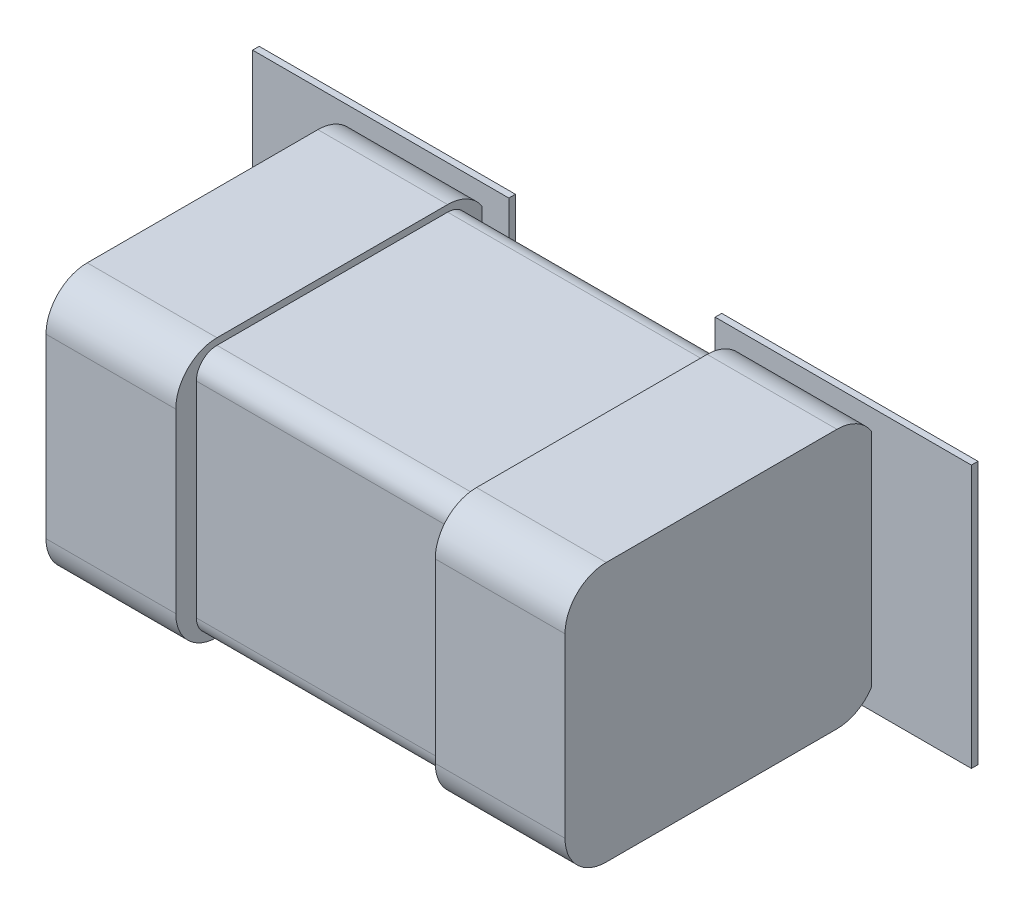
ISO-10303-21;
HEADER;
FILE_DESCRIPTION(('STEP AP214'),'2;1');
FILE_NAME('part.step','',(''),(''),'','','');
FILE_SCHEMA(('AUTOMOTIVE_DESIGN { 1 0 10303 214 1 1 1 1 }'));
ENDSEC;
DATA;
#1=APPLICATION_CONTEXT('core data for automotive mechanical design processes');
#2=APPLICATION_PROTOCOL_DEFINITION('international standard','automotive_design',2000,#1);
#3=PRODUCT_CONTEXT('',#1,'mechanical');
#4=PRODUCT('Part','Part','',(#3));
#5=PRODUCT_RELATED_PRODUCT_CATEGORY('part','',(#4));
#6=PRODUCT_DEFINITION_FORMATION('','',#4);
#7=PRODUCT_DEFINITION_CONTEXT('part definition',#1,'design');
#8=PRODUCT_DEFINITION('design','',#6,#7);
#9=PRODUCT_DEFINITION_SHAPE('','',#8);
#10=(LENGTH_UNIT() NAMED_UNIT(*) SI_UNIT(.MILLI.,.METRE.));
#11=(NAMED_UNIT(*) PLANE_ANGLE_UNIT() SI_UNIT($,.RADIAN.));
#12=(NAMED_UNIT(*) SI_UNIT($,.STERADIAN.) SOLID_ANGLE_UNIT());
#13=UNCERTAINTY_MEASURE_WITH_UNIT(LENGTH_MEASURE(1.E-05),#10,'distance_accuracy_value','');
#14=(GEOMETRIC_REPRESENTATION_CONTEXT(3) GLOBAL_UNCERTAINTY_ASSIGNED_CONTEXT((#13)) GLOBAL_UNIT_ASSIGNED_CONTEXT((#10,
#11,#12)) REPRESENTATION_CONTEXT('',''));
#15=CARTESIAN_POINT('',(0.,0.,0.));
#16=DIRECTION('',(0.,0.,1.));
#17=DIRECTION('',(1.,0.,0.));
#18=AXIS2_PLACEMENT_3D('',#15,#16,#17);
#19=CARTESIAN_POINT('',(0.,0.,0.0762));
#20=DIRECTION('',(0.,0.,1.));
#21=DIRECTION('',(1.,0.,0.));
#22=AXIS2_PLACEMENT_3D('',#19,#20,#21);
#23=PLANE('',#22);
#24=DIRECTION('',(0.,1.,0.));
#25=VECTOR('',#24,1.);
#26=CARTESIAN_POINT('',(0.318008,0.405003,0.0762));
#27=LINE('',#26,#25);
#28=CARTESIAN_POINT('',(0.318008,0.405003,0.0762));
#29=VERTEX_POINT('',#28);
#30=CARTESIAN_POINT('',(0.318008,-0.405003,0.0762));
#31=VERTEX_POINT('',#30);
#32=EDGE_CURVE('E228',#29,#31,#27,.F.);
#33=ORIENTED_EDGE('',*,*,#32,.F.);
#34=DIRECTION('',(1.,0.,0.));
#35=VECTOR('',#34,1.);
#36=CARTESIAN_POINT('',(1.1079988,0.405003,0.0762));
#37=LINE('',#36,#35);
#38=CARTESIAN_POINT('',(1.1079988,0.405003,0.0762));
#39=VERTEX_POINT('',#38);
#40=EDGE_CURVE('E215',#39,#29,#37,.F.);
#41=ORIENTED_EDGE('',*,*,#40,.F.);
#42=DIRECTION('',(0.,1.,0.));
#43=VECTOR('',#42,1.);
#44=CARTESIAN_POINT('',(1.1079988,-0.405003,0.0762));
#45=LINE('',#44,#43);
#46=CARTESIAN_POINT('',(1.1079988,-0.405003,0.0762));
#47=VERTEX_POINT('',#46);
#48=EDGE_CURVE('E356',#47,#39,#45,.T.);
#49=ORIENTED_EDGE('',*,*,#48,.F.);
#50=DIRECTION('',(1.,0.,0.));
#51=VECTOR('',#50,1.);
#52=CARTESIAN_POINT('',(0.318008,-0.405003,0.0762));
#53=LINE('',#52,#51);
#54=EDGE_CURVE('E229',#31,#47,#53,.T.);
#55=ORIENTED_EDGE('',*,*,#54,.F.);
#56=EDGE_LOOP('',(#33,#41,#49,#55));
#57=FACE_BOUND('',#56,.T.);
#58=ADVANCED_FACE('F16',(#57),#23,.F.);
#59=CARTESIAN_POINT('',(1.1079988,0.405003,0.0762));
#60=DIRECTION('',(0.,1.,0.));
#61=DIRECTION('',(0.,0.,1.));
#62=AXIS2_PLACEMENT_3D('',#59,#60,#61);
#63=PLANE('',#62);
#64=DIRECTION('',(0.,0.,-1.));
#65=VECTOR('',#64,1.);
#66=CARTESIAN_POINT('',(1.1079988,0.405003,0.0762));
#67=LINE('',#66,#65);
#68=CARTESIAN_POINT('',(1.1079988,0.405003,0.09652));
#69=VERTEX_POINT('',#68);
#70=EDGE_CURVE('E222',#39,#69,#67,.F.);
#71=ORIENTED_EDGE('',*,*,#70,.F.);
#72=ORIENTED_EDGE('',*,*,#40,.T.);
#73=DIRECTION('',(0.,0.,1.));
#74=VECTOR('',#73,1.);
#75=CARTESIAN_POINT('',(0.318008,0.405003,0.0762));
#76=LINE('',#75,#74);
#77=CARTESIAN_POINT('',(0.318008,0.405003,0.09652));
#78=VERTEX_POINT('',#77);
#79=EDGE_CURVE('E219',#78,#29,#76,.F.);
#80=ORIENTED_EDGE('',*,*,#79,.F.);
#81=DIRECTION('',(1.,0.,0.));
#82=VECTOR('',#81,1.);
#83=CARTESIAN_POINT('',(0.,0.405003,0.09652));
#84=LINE('',#83,#82);
#85=EDGE_CURVE('E354',#69,#78,#84,.F.);
#86=ORIENTED_EDGE('',*,*,#85,.F.);
#87=EDGE_LOOP('',(#71,#72,#80,#86));
#88=FACE_BOUND('',#87,.T.);
#89=ADVANCED_FACE('F217',(#88),#63,.T.);
#90=CARTESIAN_POINT('',(0.318008,0.405003,0.0762));
#91=DIRECTION('',(-1.,0.,0.));
#92=DIRECTION('',(0.,0.,1.));
#93=AXIS2_PLACEMENT_3D('',#90,#91,#92);
#94=PLANE('',#93);
#95=ORIENTED_EDGE('',*,*,#79,.T.);
#96=ORIENTED_EDGE('',*,*,#32,.T.);
#97=DIRECTION('',(0.,0.,-1.));
#98=VECTOR('',#97,1.);
#99=CARTESIAN_POINT('',(0.318008,-0.405003,0.0762));
#100=LINE('',#99,#98);
#101=CARTESIAN_POINT('',(0.318008,-0.405003,0.09652));
#102=VERTEX_POINT('',#101);
#103=EDGE_CURVE('E232',#102,#31,#100,.T.);
#104=ORIENTED_EDGE('',*,*,#103,.F.);
#105=DIRECTION('',(0.,1.,0.));
#106=VECTOR('',#105,1.);
#107=CARTESIAN_POINT('',(0.318008,0.,0.09652));
#108=LINE('',#107,#106);
#109=EDGE_CURVE('E236',#78,#102,#108,.F.);
#110=ORIENTED_EDGE('',*,*,#109,.F.);
#111=EDGE_LOOP('',(#95,#96,#104,#110));
#112=FACE_BOUND('',#111,.T.);
#113=ADVANCED_FACE('F234',(#112),#94,.T.);
#114=CARTESIAN_POINT('',(0.318008,-0.405003,0.0762));
#115=DIRECTION('',(0.,-1.,0.));
#116=DIRECTION('',(0.,0.,-1.));
#117=AXIS2_PLACEMENT_3D('',#114,#115,#116);
#118=PLANE('',#117);
#119=ORIENTED_EDGE('',*,*,#103,.T.);
#120=ORIENTED_EDGE('',*,*,#54,.T.);
#121=DIRECTION('',(0.,0.,-1.));
#122=VECTOR('',#121,1.);
#123=CARTESIAN_POINT('',(1.1079988,-0.405003,0.0762));
#124=LINE('',#123,#122);
#125=CARTESIAN_POINT('',(1.1079988,-0.405003,0.09652));
#126=VERTEX_POINT('',#125);
#127=EDGE_CURVE('E191',#126,#47,#124,.T.);
#128=ORIENTED_EDGE('',*,*,#127,.F.);
#129=DIRECTION('',(1.,0.,0.));
#130=VECTOR('',#129,1.);
#131=CARTESIAN_POINT('',(0.,-0.405003,0.09652));
#132=LINE('',#131,#130);
#133=EDGE_CURVE('E350',#102,#126,#132,.T.);
#134=ORIENTED_EDGE('',*,*,#133,.F.);
#135=EDGE_LOOP('',(#119,#120,#128,#134));
#136=FACE_BOUND('',#135,.T.);
#137=ADVANCED_FACE('F367',(#136),#118,.T.);
#138=CARTESIAN_POINT('',(1.1079988,-0.405003,0.0762));
#139=DIRECTION('',(1.,0.,0.));
#140=DIRECTION('',(0.,0.,-1.));
#141=AXIS2_PLACEMENT_3D('',#138,#139,#140);
#142=PLANE('',#141);
#143=ORIENTED_EDGE('',*,*,#127,.T.);
#144=ORIENTED_EDGE('',*,*,#48,.T.);
#145=ORIENTED_EDGE('',*,*,#70,.T.);
#146=DIRECTION('',(0.,1.,0.));
#147=VECTOR('',#146,1.);
#148=CARTESIAN_POINT('',(1.1079988,0.,0.09652));
#149=LINE('',#148,#147);
#150=EDGE_CURVE('E347',#126,#69,#149,.T.);
#151=ORIENTED_EDGE('',*,*,#150,.F.);
#152=EDGE_LOOP('',(#143,#144,#145,#151));
#153=FACE_BOUND('',#152,.T.);
#154=ADVANCED_FACE('F371',(#153),#142,.T.);
#155=CARTESIAN_POINT('',(0.800000000000102,-0.399999999999924,0.0762));
#156=DIRECTION('',(1.,0.,0.));
#157=DIRECTION('',(0.,0.,-1.));
#158=AXIS2_PLACEMENT_3D('',#155,#156,#157);
#159=PLANE('',#158);
#160=CARTESIAN_POINT('',(0.800000000000102,-0.272999999999924,0.2032));
#161=DIRECTION('',(1.,0.,0.));
#162=DIRECTION('',(0.,0.,-1.));
#163=AXIS2_PLACEMENT_3D('',#160,#161,#162);
#164=CIRCLE('',#163,0.127);
#165=CARTESIAN_POINT('',(0.800000000000102,-0.341908472628476,0.0965199999999994));
#166=VERTEX_POINT('',#165);
#167=CARTESIAN_POINT('',(0.800000000000102,-0.399999999999924,0.2032));
#168=VERTEX_POINT('',#167);
#169=EDGE_CURVE('E318',#166,#168,#164,.F.);
#170=ORIENTED_EDGE('',*,*,#169,.F.);
#171=DIRECTION('',(0.,1.,0.));
#172=VECTOR('',#171,1.);
#173=CARTESIAN_POINT('',(0.800000000000102,0.,0.09652));
#174=LINE('',#173,#172);
#175=CARTESIAN_POINT('',(0.800000000000102,0.341908472628476,0.0965199999999994));
#176=VERTEX_POINT('',#175);
#177=EDGE_CURVE('E182',#176,#166,#174,.F.);
#178=ORIENTED_EDGE('',*,*,#177,.F.);
#179=CARTESIAN_POINT('',(0.800000000000102,0.272999999999924,0.2032));
#180=DIRECTION('',(1.,0.,0.));
#181=DIRECTION('',(0.,0.,-1.));
#182=AXIS2_PLACEMENT_3D('',#179,#180,#181);
#183=CIRCLE('',#182,0.127);
#184=CARTESIAN_POINT('',(0.800000000000102,0.399999999999924,0.2032));
#185=VERTEX_POINT('',#184);
#186=EDGE_CURVE('E19',#185,#176,#183,.F.);
#187=ORIENTED_EDGE('',*,*,#186,.F.);
#188=DIRECTION('',(0.,0.,1.));
#189=VECTOR('',#188,1.);
#190=CARTESIAN_POINT('',(0.800000000000102,0.399999999999924,0.0762));
#191=LINE('',#190,#189);
#192=CARTESIAN_POINT('',(0.800000000000102,0.399999999999924,0.9144));
#193=VERTEX_POINT('',#192);
#194=EDGE_CURVE('E336',#193,#185,#191,.F.);
#195=ORIENTED_EDGE('',*,*,#194,.F.);
#196=CARTESIAN_POINT('',(0.800000000000102,0.272999999999924,0.9144));
#197=DIRECTION('',(-1.,0.,0.));
#198=DIRECTION('',(0.,0.,1.));
#199=AXIS2_PLACEMENT_3D('',#196,#197,#198);
#200=CIRCLE('',#199,0.127);
#201=CARTESIAN_POINT('',(0.800000000000102,0.272999999999924,1.0414));
#202=VERTEX_POINT('',#201);
#203=EDGE_CURVE('E326',#202,#193,#200,.T.);
#204=ORIENTED_EDGE('',*,*,#203,.F.);
#205=DIRECTION('',(0.,1.,0.));
#206=VECTOR('',#205,1.);
#207=CARTESIAN_POINT('',(0.800000000000102,0.,1.0414));
#208=LINE('',#207,#206);
#209=CARTESIAN_POINT('',(0.800000000000102,-0.272999999999924,1.0414));
#210=VERTEX_POINT('',#209);
#211=EDGE_CURVE('E333',#210,#202,#208,.T.);
#212=ORIENTED_EDGE('',*,*,#211,.F.);
#213=CARTESIAN_POINT('',(0.800000000000102,-0.272999999999924,0.9144));
#214=DIRECTION('',(1.,0.,0.));
#215=DIRECTION('',(0.,0.,-1.));
#216=AXIS2_PLACEMENT_3D('',#213,#214,#215);
#217=CIRCLE('',#216,0.127);
#218=CARTESIAN_POINT('',(0.800000000000102,-0.399999999999924,0.9144));
#219=VERTEX_POINT('',#218);
#220=EDGE_CURVE('E322',#219,#210,#217,.F.);
#221=ORIENTED_EDGE('',*,*,#220,.F.);
#222=DIRECTION('',(0.,0.,-1.));
#223=VECTOR('',#222,1.);
#224=CARTESIAN_POINT('',(0.800000000000102,-0.399999999999924,0.0762));
#225=LINE('',#224,#223);
#226=EDGE_CURVE('E324',#168,#219,#225,.F.);
#227=ORIENTED_EDGE('',*,*,#226,.F.);
#228=EDGE_LOOP('',(#170,#178,#187,#195,#204,#212,#221,#227));
#229=FACE_BOUND('',#228,.T.);
#230=ADVANCED_FACE('F373',(#229),#159,.T.);
#231=CARTESIAN_POINT('',(0.,0.,0.09652));
#232=DIRECTION('',(0.,0.,1.));
#233=DIRECTION('',(1.,0.,0.));
#234=AXIS2_PLACEMENT_3D('',#231,#232,#233);
#235=PLANE('',#234);
#236=DIRECTION('',(1.,0.,0.));
#237=VECTOR('',#236,1.);
#238=CARTESIAN_POINT('',(0.800000000000102,0.341908472628475,0.0965199999999988));
#239=LINE('',#238,#237);
#240=CARTESIAN_POINT('',(0.399999999999924,0.341908472628476,0.0965199999999994));
#241=VERTEX_POINT('',#240);
#242=EDGE_CURVE('E344',#176,#241,#239,.F.);
#243=ORIENTED_EDGE('',*,*,#242,.F.);
#244=ORIENTED_EDGE('',*,*,#177,.T.);
#245=DIRECTION('',(1.,0.,0.));
#246=VECTOR('',#245,1.);
#247=CARTESIAN_POINT('',(0.800000000000102,-0.341908472628475,0.0965199999999988));
#248=LINE('',#247,#246);
#249=CARTESIAN_POINT('',(0.399999999999924,-0.341908472628476,0.0965199999999994));
#250=VERTEX_POINT('',#249);
#251=EDGE_CURVE('E321',#250,#166,#248,.T.);
#252=ORIENTED_EDGE('',*,*,#251,.F.);
#253=DIRECTION('',(0.,1.,0.));
#254=VECTOR('',#253,1.);
#255=CARTESIAN_POINT('',(0.399999999999924,0.379679999999924,0.09652));
#256=LINE('',#255,#254);
#257=EDGE_CURVE('E317',#250,#241,#256,.T.);
#258=ORIENTED_EDGE('',*,*,#257,.T.);
#259=EDGE_LOOP('',(#243,#244,#252,#258));
#260=FACE_BOUND('',#259,.T.);
#261=ORIENTED_EDGE('',*,*,#133,.T.);
#262=ORIENTED_EDGE('',*,*,#150,.T.);
#263=ORIENTED_EDGE('',*,*,#85,.T.);
#264=ORIENTED_EDGE('',*,*,#109,.T.);
#265=EDGE_LOOP('',(#261,#262,#263,#264));
#266=FACE_BOUND('',#265,.T.);
#267=ADVANCED_FACE('F369',(#260,#266),#235,.T.);
#268=CARTESIAN_POINT('',(0.800000000000102,0.272999999999924,0.2032));
#269=DIRECTION('',(1.,0.,0.));
#270=DIRECTION('',(0.,0.,-1.));
#271=AXIS2_PLACEMENT_3D('',#268,#269,#270);
#272=CYLINDRICAL_SURFACE('',#271,0.127);
#273=DIRECTION('',(1.,0.,0.));
#274=VECTOR('',#273,1.);
#275=CARTESIAN_POINT('',(0.800000000000102,0.399999999999924,0.2032));
#276=LINE('',#275,#274);
#277=CARTESIAN_POINT('',(0.399999999999924,0.399999999999924,0.2032));
#278=VERTEX_POINT('',#277);
#279=EDGE_CURVE('E329',#185,#278,#276,.F.);
#280=ORIENTED_EDGE('',*,*,#279,.F.);
#281=ORIENTED_EDGE('',*,*,#186,.T.);
#282=ORIENTED_EDGE('',*,*,#242,.T.);
#283=CARTESIAN_POINT('',(0.399999999999924,0.272999999999924,0.2032));
#284=DIRECTION('',(1.,0.,0.));
#285=DIRECTION('',(0.,0.,-1.));
#286=AXIS2_PLACEMENT_3D('',#283,#284,#285);
#287=CIRCLE('',#286,0.127);
#288=EDGE_CURVE('E315',#241,#278,#287,.T.);
#289=ORIENTED_EDGE('',*,*,#288,.T.);
#290=EDGE_LOOP('',(#280,#281,#282,#289));
#291=FACE_BOUND('',#290,.T.);
#292=ADVANCED_FACE('F502',(#291),#272,.T.);
#293=CARTESIAN_POINT('',(0.800000000000102,0.399999999999924,0.0762));
#294=DIRECTION('',(0.,1.,0.));
#295=DIRECTION('',(0.,0.,1.));
#296=AXIS2_PLACEMENT_3D('',#293,#294,#295);
#297=PLANE('',#296);
#298=ORIENTED_EDGE('',*,*,#194,.T.);
#299=ORIENTED_EDGE('',*,*,#279,.T.);
#300=DIRECTION('',(0.,0.,-1.));
#301=VECTOR('',#300,1.);
#302=CARTESIAN_POINT('',(0.399999999999924,0.399999999999924,1.0414));
#303=LINE('',#302,#301);
#304=CARTESIAN_POINT('',(0.399999999999924,0.399999999999924,0.9144));
#305=VERTEX_POINT('',#304);
#306=EDGE_CURVE('E314',#278,#305,#303,.F.);
#307=ORIENTED_EDGE('',*,*,#306,.T.);
#308=DIRECTION('',(-1.,0.,0.));
#309=VECTOR('',#308,1.);
#310=CARTESIAN_POINT('',(0.80376887661321,0.399999999999924,0.9144));
#311=LINE('',#310,#309);
#312=EDGE_CURVE('E328',#193,#305,#311,.T.);
#313=ORIENTED_EDGE('',*,*,#312,.F.);
#314=EDGE_LOOP('',(#298,#299,#307,#313));
#315=FACE_BOUND('',#314,.T.);
#316=ADVANCED_FACE('F499',(#315),#297,.T.);
#317=CARTESIAN_POINT('',(0.80376887661321,0.272999999999924,0.9144));
#318=DIRECTION('',(-1.,0.,0.));
#319=DIRECTION('',(0.,0.,1.));
#320=AXIS2_PLACEMENT_3D('',#317,#318,#319);
#321=CYLINDRICAL_SURFACE('',#320,0.127);
#322=ORIENTED_EDGE('',*,*,#312,.T.);
#323=CARTESIAN_POINT('',(0.399999999999924,0.272999999999924,0.9144));
#324=DIRECTION('',(-1.,0.,0.));
#325=DIRECTION('',(0.,0.,1.));
#326=AXIS2_PLACEMENT_3D('',#323,#324,#325);
#327=CIRCLE('',#326,0.127);
#328=CARTESIAN_POINT('',(0.399999999999924,0.272999999999924,1.0414));
#329=VERTEX_POINT('',#328);
#330=EDGE_CURVE('E312',#305,#329,#327,.F.);
#331=ORIENTED_EDGE('',*,*,#330,.T.);
#332=DIRECTION('',(1.,0.,0.));
#333=VECTOR('',#332,1.);
#334=CARTESIAN_POINT('',(0.,0.272999999999924,1.0414));
#335=LINE('',#334,#333);
#336=EDGE_CURVE('E362',#202,#329,#335,.F.);
#337=ORIENTED_EDGE('',*,*,#336,.F.);
#338=ORIENTED_EDGE('',*,*,#203,.T.);
#339=EDGE_LOOP('',(#322,#331,#337,#338));
#340=FACE_BOUND('',#339,.T.);
#341=ADVANCED_FACE('F495',(#340),#321,.T.);
#342=CARTESIAN_POINT('',(0.,0.,1.0414));
#343=DIRECTION('',(0.,0.,1.));
#344=DIRECTION('',(1.,0.,0.));
#345=AXIS2_PLACEMENT_3D('',#342,#343,#344);
#346=PLANE('',#345);
#347=ORIENTED_EDGE('',*,*,#211,.T.);
#348=ORIENTED_EDGE('',*,*,#336,.T.);
#349=DIRECTION('',(0.,1.,0.));
#350=VECTOR('',#349,1.);
#351=CARTESIAN_POINT('',(0.399999999999924,0.379679999999924,1.0414));
#352=LINE('',#351,#350);
#353=CARTESIAN_POINT('',(0.399999999999924,-0.272999999999924,1.0414));
#354=VERTEX_POINT('',#353);
#355=EDGE_CURVE('E311',#329,#354,#352,.F.);
#356=ORIENTED_EDGE('',*,*,#355,.T.);
#357=DIRECTION('',(1.,0.,0.));
#358=VECTOR('',#357,1.);
#359=CARTESIAN_POINT('',(-0.803919680620212,-0.272999999999924,1.0414));
#360=LINE('',#359,#358);
#361=EDGE_CURVE('E325',#210,#354,#360,.F.);
#362=ORIENTED_EDGE('',*,*,#361,.F.);
#363=EDGE_LOOP('',(#347,#348,#356,#362));
#364=FACE_BOUND('',#363,.T.);
#365=ADVANCED_FACE('F491',(#364),#346,.T.);
#366=CARTESIAN_POINT('',(-0.803919680620212,-0.272999999999924,0.9144));
#367=DIRECTION('',(1.,0.,0.));
#368=DIRECTION('',(0.,0.,-1.));
#369=AXIS2_PLACEMENT_3D('',#366,#367,#368);
#370=CYLINDRICAL_SURFACE('',#369,0.127);
#371=DIRECTION('',(1.,0.,0.));
#372=VECTOR('',#371,1.);
#373=CARTESIAN_POINT('',(-0.800000000000102,-0.399999999999924,0.9144));
#374=LINE('',#373,#372);
#375=CARTESIAN_POINT('',(0.399999999999924,-0.399999999999924,0.9144));
#376=VERTEX_POINT('',#375);
#377=EDGE_CURVE('E360',#219,#376,#374,.F.);
#378=ORIENTED_EDGE('',*,*,#377,.F.);
#379=ORIENTED_EDGE('',*,*,#220,.T.);
#380=ORIENTED_EDGE('',*,*,#361,.T.);
#381=CARTESIAN_POINT('',(0.399999999999924,-0.272999999999924,0.9144));
#382=DIRECTION('',(1.,0.,0.));
#383=DIRECTION('',(0.,0.,-1.));
#384=AXIS2_PLACEMENT_3D('',#381,#382,#383);
#385=CIRCLE('',#384,0.127);
#386=EDGE_CURVE('E309',#354,#376,#385,.T.);
#387=ORIENTED_EDGE('',*,*,#386,.T.);
#388=EDGE_LOOP('',(#378,#379,#380,#387));
#389=FACE_BOUND('',#388,.T.);
#390=ADVANCED_FACE('F487',(#389),#370,.T.);
#391=CARTESIAN_POINT('',(-0.800000000000102,-0.399999999999924,0.0762));
#392=DIRECTION('',(0.,-1.,0.));
#393=DIRECTION('',(0.,0.,-1.));
#394=AXIS2_PLACEMENT_3D('',#391,#392,#393);
#395=PLANE('',#394);
#396=DIRECTION('',(0.,0.,-1.));
#397=VECTOR('',#396,1.);
#398=CARTESIAN_POINT('',(0.399999999999924,-0.399999999999924,1.0414));
#399=LINE('',#398,#397);
#400=CARTESIAN_POINT('',(0.399999999999924,-0.399999999999924,0.2032));
#401=VERTEX_POINT('',#400);
#402=EDGE_CURVE('E308',#376,#401,#399,.T.);
#403=ORIENTED_EDGE('',*,*,#402,.T.);
#404=DIRECTION('',(1.,0.,0.));
#405=VECTOR('',#404,1.);
#406=CARTESIAN_POINT('',(0.800000000000102,-0.399999999999924,0.2032));
#407=LINE('',#406,#405);
#408=EDGE_CURVE('E525',#168,#401,#407,.F.);
#409=ORIENTED_EDGE('',*,*,#408,.F.);
#410=ORIENTED_EDGE('',*,*,#226,.T.);
#411=ORIENTED_EDGE('',*,*,#377,.T.);
#412=EDGE_LOOP('',(#403,#409,#410,#411));
#413=FACE_BOUND('',#412,.T.);
#414=ADVANCED_FACE('F483',(#413),#395,.T.);
#415=CARTESIAN_POINT('',(0.800000000000102,-0.272999999999924,0.2032));
#416=DIRECTION('',(1.,0.,0.));
#417=DIRECTION('',(0.,0.,-1.));
#418=AXIS2_PLACEMENT_3D('',#415,#416,#417);
#419=CYLINDRICAL_SURFACE('',#418,0.127);
#420=ORIENTED_EDGE('',*,*,#251,.T.);
#421=ORIENTED_EDGE('',*,*,#169,.T.);
#422=ORIENTED_EDGE('',*,*,#408,.T.);
#423=CARTESIAN_POINT('',(0.399999999999924,-0.272999999999924,0.2032));
#424=DIRECTION('',(1.,0.,0.));
#425=DIRECTION('',(0.,0.,-1.));
#426=AXIS2_PLACEMENT_3D('',#423,#424,#425);
#427=CIRCLE('',#426,0.127);
#428=EDGE_CURVE('E305',#401,#250,#427,.T.);
#429=ORIENTED_EDGE('',*,*,#428,.T.);
#430=EDGE_LOOP('',(#420,#421,#422,#429));
#431=FACE_BOUND('',#430,.T.);
#432=ADVANCED_FACE('F479',(#431),#419,.T.);
#433=CARTESIAN_POINT('',(0.399999999999924,0.379679999999924,1.0414));
#434=DIRECTION('',(1.,0.,0.));
#435=DIRECTION('',(0.,0.,-1.));
#436=AXIS2_PLACEMENT_3D('',#433,#434,#435);
#437=PLANE('',#436);
#438=DIRECTION('',(0.,0.,1.));
#439=VECTOR('',#438,1.);
#440=CARTESIAN_POINT('',(0.399999999999924,-0.379679999999924,1.0414));
#441=LINE('',#440,#439);
#442=CARTESIAN_POINT('',(0.399999999999924,-0.379679999999924,0.9144));
#443=VERTEX_POINT('',#442);
#444=CARTESIAN_POINT('',(0.399999999999924,-0.379679999999924,0.2032));
#445=VERTEX_POINT('',#444);
#446=EDGE_CURVE('E294',#443,#445,#441,.F.);
#447=ORIENTED_EDGE('',*,*,#446,.T.);
#448=CARTESIAN_POINT('',(0.399999999999924,-0.316179999999924,0.2032));
#449=DIRECTION('',(1.,0.,0.));
#450=DIRECTION('',(0.,0.,-1.));
#451=AXIS2_PLACEMENT_3D('',#448,#449,#450);
#452=CIRCLE('',#451,0.0635);
#453=CARTESIAN_POINT('',(0.399999999999924,-0.316179999999924,0.1397));
#454=VERTEX_POINT('',#453);
#455=EDGE_CURVE('E290',#454,#445,#452,.F.);
#456=ORIENTED_EDGE('',*,*,#455,.F.);
#457=DIRECTION('',(0.,1.,0.));
#458=VECTOR('',#457,1.);
#459=CARTESIAN_POINT('',(0.399999999999924,0.379679999999924,0.1397));
#460=LINE('',#459,#458);
#461=CARTESIAN_POINT('',(0.399999999999924,0.316179999999924,0.1397));
#462=VERTEX_POINT('',#461);
#463=EDGE_CURVE('E536',#454,#462,#460,.T.);
#464=ORIENTED_EDGE('',*,*,#463,.T.);
#465=CARTESIAN_POINT('',(0.399999999999924,0.316179999999924,0.2032));
#466=DIRECTION('',(-1.,0.,0.));
#467=DIRECTION('',(0.,0.,1.));
#468=AXIS2_PLACEMENT_3D('',#465,#466,#467);
#469=CIRCLE('',#468,0.0635);
#470=CARTESIAN_POINT('',(0.399999999999924,0.379679999999924,0.2032));
#471=VERTEX_POINT('',#470);
#472=EDGE_CURVE('E285',#471,#462,#469,.T.);
#473=ORIENTED_EDGE('',*,*,#472,.F.);
#474=DIRECTION('',(0.,0.,-1.));
#475=VECTOR('',#474,1.);
#476=CARTESIAN_POINT('',(0.399999999999924,0.379679999999924,1.0414));
#477=LINE('',#476,#475);
#478=CARTESIAN_POINT('',(0.399999999999924,0.379679999999924,0.9144));
#479=VERTEX_POINT('',#478);
#480=EDGE_CURVE('E304',#471,#479,#477,.F.);
#481=ORIENTED_EDGE('',*,*,#480,.T.);
#482=CARTESIAN_POINT('',(0.399999999999924,0.316179999999924,0.9144));
#483=DIRECTION('',(1.,0.,0.));
#484=DIRECTION('',(0.,0.,-1.));
#485=AXIS2_PLACEMENT_3D('',#482,#483,#484);
#486=CIRCLE('',#485,0.0635);
#487=CARTESIAN_POINT('',(0.399999999999924,0.316179999999924,0.9779));
#488=VERTEX_POINT('',#487);
#489=EDGE_CURVE('E300',#488,#479,#486,.F.);
#490=ORIENTED_EDGE('',*,*,#489,.F.);
#491=DIRECTION('',(0.,1.,0.));
#492=VECTOR('',#491,1.);
#493=CARTESIAN_POINT('',(0.399999999999924,0.379679999999924,0.9779));
#494=LINE('',#493,#492);
#495=CARTESIAN_POINT('',(0.399999999999924,-0.316179999999924,0.9779));
#496=VERTEX_POINT('',#495);
#497=EDGE_CURVE('E299',#488,#496,#494,.F.);
#498=ORIENTED_EDGE('',*,*,#497,.T.);
#499=CARTESIAN_POINT('',(0.399999999999924,-0.316179999999924,0.9144));
#500=DIRECTION('',(-1.,0.,0.));
#501=DIRECTION('',(0.,0.,1.));
#502=AXIS2_PLACEMENT_3D('',#499,#500,#501);
#503=CIRCLE('',#502,0.0635);
#504=EDGE_CURVE('E295',#443,#496,#503,.T.);
#505=ORIENTED_EDGE('',*,*,#504,.F.);
#506=EDGE_LOOP('',(#447,#456,#464,#473,#481,#490,#498,#505));
#507=FACE_BOUND('',#506,.T.);
#508=ORIENTED_EDGE('',*,*,#402,.F.);
#509=ORIENTED_EDGE('',*,*,#386,.F.);
#510=ORIENTED_EDGE('',*,*,#355,.F.);
#511=ORIENTED_EDGE('',*,*,#330,.F.);
#512=ORIENTED_EDGE('',*,*,#306,.F.);
#513=ORIENTED_EDGE('',*,*,#288,.F.);
#514=ORIENTED_EDGE('',*,*,#257,.F.);
#515=ORIENTED_EDGE('',*,*,#428,.F.);
#516=EDGE_LOOP('',(#508,#509,#510,#511,#512,#513,#514,#515));
#517=FACE_BOUND('',#516,.T.);
#518=ADVANCED_FACE('F475',(#507,#517),#437,.F.);
#519=CARTESIAN_POINT('',(0.,0.,0.0762));
#520=DIRECTION('',(0.,0.,1.));
#521=DIRECTION('',(1.,0.,0.));
#522=AXIS2_PLACEMENT_3D('',#519,#520,#521);
#523=PLANE('',#522);
#524=DIRECTION('',(0.,1.,0.));
#525=VECTOR('',#524,1.);
#526=CARTESIAN_POINT('',(-0.318008,-0.405003,0.0762));
#527=LINE('',#526,#525);
#528=CARTESIAN_POINT('',(-0.318008,-0.405003,0.0762));
#529=VERTEX_POINT('',#528);
#530=CARTESIAN_POINT('',(-0.318008,0.405003,0.0762));
#531=VERTEX_POINT('',#530);
#532=EDGE_CURVE('E576',#529,#531,#527,.T.);
#533=ORIENTED_EDGE('',*,*,#532,.F.);
#534=DIRECTION('',(1.,0.,0.));
#535=VECTOR('',#534,1.);
#536=CARTESIAN_POINT('',(-1.1079988,-0.405003,0.0762));
#537=LINE('',#536,#535);
#538=CARTESIAN_POINT('',(-1.1079988,-0.405003,0.0762));
#539=VERTEX_POINT('',#538);
#540=EDGE_CURVE('E564',#539,#529,#537,.T.);
#541=ORIENTED_EDGE('',*,*,#540,.F.);
#542=DIRECTION('',(0.,1.,0.));
#543=VECTOR('',#542,1.);
#544=CARTESIAN_POINT('',(-1.1079988,0.405003,0.0762));
#545=LINE('',#544,#543);
#546=CARTESIAN_POINT('',(-1.1079988,0.405003,0.0762));
#547=VERTEX_POINT('',#546);
#548=EDGE_CURVE('E591',#547,#539,#545,.F.);
#549=ORIENTED_EDGE('',*,*,#548,.F.);
#550=DIRECTION('',(1.,0.,0.));
#551=VECTOR('',#550,1.);
#552=CARTESIAN_POINT('',(-0.318008,0.405003,0.0762));
#553=LINE('',#552,#551);
#554=EDGE_CURVE('E582',#531,#547,#553,.F.);
#555=ORIENTED_EDGE('',*,*,#554,.F.);
#556=EDGE_LOOP('',(#533,#541,#549,#555));
#557=FACE_BOUND('',#556,.T.);
#558=ADVANCED_FACE('F471',(#557),#523,.F.);
#559=CARTESIAN_POINT('',(-0.399999999999924,0.379679999999924,1.0414));
#560=DIRECTION('',(0.,-1.,0.));
#561=DIRECTION('',(0.,0.,-1.));
#562=AXIS2_PLACEMENT_3D('',#559,#560,#561);
#563=PLANE('',#562);
#564=DIRECTION('',(1.,0.,0.));
#565=VECTOR('',#564,1.);
#566=CARTESIAN_POINT('',(-0.404108720937406,0.379679999999924,0.9144));
#567=LINE('',#566,#565);
#568=CARTESIAN_POINT('',(-0.399999999999924,0.379679999999924,0.9144));
#569=VERTEX_POINT('',#568);
#570=EDGE_CURVE('E303',#479,#569,#567,.F.);
#571=ORIENTED_EDGE('',*,*,#570,.F.);
#572=ORIENTED_EDGE('',*,*,#480,.F.);
#573=DIRECTION('',(-1.,0.,0.));
#574=VECTOR('',#573,1.);
#575=CARTESIAN_POINT('',(0.403768876613286,0.379679999999924,0.2032));
#576=LINE('',#575,#574);
#577=CARTESIAN_POINT('',(-0.399999999999924,0.379679999999924,0.2032));
#578=VERTEX_POINT('',#577);
#579=EDGE_CURVE('E289',#578,#471,#576,.F.);
#580=ORIENTED_EDGE('',*,*,#579,.F.);
#581=DIRECTION('',(0.,0.,1.));
#582=VECTOR('',#581,1.);
#583=CARTESIAN_POINT('',(-0.399999999999924,0.379679999999924,1.0414));
#584=LINE('',#583,#582);
#585=EDGE_CURVE('E284',#578,#569,#584,.T.);
#586=ORIENTED_EDGE('',*,*,#585,.T.);
#587=EDGE_LOOP('',(#571,#572,#580,#586));
#588=FACE_BOUND('',#587,.T.);
#589=ADVANCED_FACE('F467',(#588),#563,.F.);
#590=CARTESIAN_POINT('',(-0.404108720937406,0.316179999999924,0.9144));
#591=DIRECTION('',(1.,0.,0.));
#592=DIRECTION('',(0.,0.,-1.));
#593=AXIS2_PLACEMENT_3D('',#590,#591,#592);
#594=CYLINDRICAL_SURFACE('',#593,0.0635);
#595=CARTESIAN_POINT('',(-0.399999999999924,0.316179999999924,0.9144));
#596=DIRECTION('',(1.,0.,0.));
#597=DIRECTION('',(0.,0.,-1.));
#598=AXIS2_PLACEMENT_3D('',#595,#596,#597);
#599=CIRCLE('',#598,0.0635);
#600=CARTESIAN_POINT('',(-0.399999999999924,0.316179999999924,0.9779));
#601=VERTEX_POINT('',#600);
#602=EDGE_CURVE('E282',#569,#601,#599,.T.);
#603=ORIENTED_EDGE('',*,*,#602,.T.);
#604=DIRECTION('',(-1.,0.,0.));
#605=VECTOR('',#604,1.);
#606=CARTESIAN_POINT('',(0.399999999999924,0.316179999999924,0.9779));
#607=LINE('',#606,#605);
#608=EDGE_CURVE('E543',#601,#488,#607,.F.);
#609=ORIENTED_EDGE('',*,*,#608,.T.);
#610=ORIENTED_EDGE('',*,*,#489,.T.);
#611=ORIENTED_EDGE('',*,*,#570,.T.);
#612=EDGE_LOOP('',(#603,#609,#610,#611));
#613=FACE_BOUND('',#612,.T.);
#614=ADVANCED_FACE('F463',(#613),#594,.T.);
#615=CARTESIAN_POINT('',(0.399999999999924,0.379679999999924,0.9779));
#616=DIRECTION('',(0.,0.,-1.));
#617=DIRECTION('',(-1.,0.,0.));
#618=AXIS2_PLACEMENT_3D('',#615,#616,#617);
#619=PLANE('',#618);
#620=DIRECTION('',(-1.,0.,0.));
#621=VECTOR('',#620,1.);
#622=CARTESIAN_POINT('',(0.403919680620288,-0.316179999999924,0.9779));
#623=LINE('',#622,#621);
#624=CARTESIAN_POINT('',(-0.399999999999924,-0.316179999999924,0.9779));
#625=VERTEX_POINT('',#624);
#626=EDGE_CURVE('E298',#496,#625,#623,.T.);
#627=ORIENTED_EDGE('',*,*,#626,.F.);
#628=ORIENTED_EDGE('',*,*,#497,.F.);
#629=ORIENTED_EDGE('',*,*,#608,.F.);
#630=DIRECTION('',(0.,1.,0.));
#631=VECTOR('',#630,1.);
#632=CARTESIAN_POINT('',(-0.399999999999924,0.399999999999924,0.9779));
#633=LINE('',#632,#631);
#634=EDGE_CURVE('E281',#601,#625,#633,.F.);
#635=ORIENTED_EDGE('',*,*,#634,.T.);
#636=EDGE_LOOP('',(#627,#628,#629,#635));
#637=FACE_BOUND('',#636,.T.);
#638=ADVANCED_FACE('F459',(#637),#619,.F.);
#639=CARTESIAN_POINT('',(0.403919680620288,-0.316179999999924,0.9144));
#640=DIRECTION('',(-1.,0.,0.));
#641=DIRECTION('',(0.,0.,1.));
#642=AXIS2_PLACEMENT_3D('',#639,#640,#641);
#643=CYLINDRICAL_SURFACE('',#642,0.0635);
#644=ORIENTED_EDGE('',*,*,#504,.T.);
#645=ORIENTED_EDGE('',*,*,#626,.T.);
#646=CARTESIAN_POINT('',(-0.399999999999924,-0.316179999999924,0.9144));
#647=DIRECTION('',(-1.,0.,0.));
#648=DIRECTION('',(0.,0.,1.));
#649=AXIS2_PLACEMENT_3D('',#646,#647,#648);
#650=CIRCLE('',#649,0.0635);
#651=CARTESIAN_POINT('',(-0.399999999999924,-0.379679999999924,0.9144));
#652=VERTEX_POINT('',#651);
#653=EDGE_CURVE('E279',#625,#652,#650,.F.);
#654=ORIENTED_EDGE('',*,*,#653,.T.);
#655=DIRECTION('',(1.,0.,0.));
#656=VECTOR('',#655,1.);
#657=CARTESIAN_POINT('',(0.399999999999924,-0.379679999999924,0.9144));
#658=LINE('',#657,#656);
#659=EDGE_CURVE('E542',#652,#443,#658,.T.);
#660=ORIENTED_EDGE('',*,*,#659,.T.);
#661=EDGE_LOOP('',(#644,#645,#654,#660));
#662=FACE_BOUND('',#661,.T.);
#663=ADVANCED_FACE('F455',(#662),#643,.T.);
#664=CARTESIAN_POINT('',(0.399999999999924,-0.379679999999924,1.0414));
#665=DIRECTION('',(0.,1.,0.));
#666=DIRECTION('',(0.,0.,1.));
#667=AXIS2_PLACEMENT_3D('',#664,#665,#666);
#668=PLANE('',#667);
#669=DIRECTION('',(1.,0.,0.));
#670=VECTOR('',#669,1.);
#671=CARTESIAN_POINT('',(-0.403768876613286,-0.379679999999924,0.2032));
#672=LINE('',#671,#670);
#673=CARTESIAN_POINT('',(-0.399999999999924,-0.379679999999924,0.2032));
#674=VERTEX_POINT('',#673);
#675=EDGE_CURVE('E293',#445,#674,#672,.F.);
#676=ORIENTED_EDGE('',*,*,#675,.F.);
#677=ORIENTED_EDGE('',*,*,#446,.F.);
#678=ORIENTED_EDGE('',*,*,#659,.F.);
#679=DIRECTION('',(0.,0.,1.));
#680=VECTOR('',#679,1.);
#681=CARTESIAN_POINT('',(-0.399999999999924,-0.379679999999924,1.0414));
#682=LINE('',#681,#680);
#683=EDGE_CURVE('E278',#652,#674,#682,.F.);
#684=ORIENTED_EDGE('',*,*,#683,.T.);
#685=EDGE_LOOP('',(#676,#677,#678,#684));
#686=FACE_BOUND('',#685,.T.);
#687=ADVANCED_FACE('F451',(#686),#668,.F.);
#688=CARTESIAN_POINT('',(-0.403768876613286,-0.316179999999924,0.2032));
#689=DIRECTION('',(1.,0.,0.));
#690=DIRECTION('',(0.,0.,-1.));
#691=AXIS2_PLACEMENT_3D('',#688,#689,#690);
#692=CYLINDRICAL_SURFACE('',#691,0.0635);
#693=CARTESIAN_POINT('',(-0.399999999999924,-0.316179999999924,0.2032));
#694=DIRECTION('',(1.,0.,0.));
#695=DIRECTION('',(0.,0.,-1.));
#696=AXIS2_PLACEMENT_3D('',#693,#694,#695);
#697=CIRCLE('',#696,0.0635);
#698=CARTESIAN_POINT('',(-0.399999999999924,-0.316179999999924,0.1397));
#699=VERTEX_POINT('',#698);
#700=EDGE_CURVE('E276',#674,#699,#697,.T.);
#701=ORIENTED_EDGE('',*,*,#700,.T.);
#702=DIRECTION('',(1.,0.,0.));
#703=VECTOR('',#702,1.);
#704=CARTESIAN_POINT('',(-0.399999999999924,-0.316179999999924,0.1397));
#705=LINE('',#704,#703);
#706=EDGE_CURVE('E557',#699,#454,#705,.T.);
#707=ORIENTED_EDGE('',*,*,#706,.T.);
#708=ORIENTED_EDGE('',*,*,#455,.T.);
#709=ORIENTED_EDGE('',*,*,#675,.T.);
#710=EDGE_LOOP('',(#701,#707,#708,#709));
#711=FACE_BOUND('',#710,.T.);
#712=ADVANCED_FACE('F447',(#711),#692,.T.);
#713=CARTESIAN_POINT('',(-0.399999999999924,0.379679999999924,0.1397));
#714=DIRECTION('',(0.,0.,1.));
#715=DIRECTION('',(1.,0.,0.));
#716=AXIS2_PLACEMENT_3D('',#713,#714,#715);
#717=PLANE('',#716);
#718=ORIENTED_EDGE('',*,*,#706,.F.);
#719=DIRECTION('',(0.,1.,0.));
#720=VECTOR('',#719,1.);
#721=CARTESIAN_POINT('',(-0.399999999999924,0.399999999999924,0.1397));
#722=LINE('',#721,#720);
#723=CARTESIAN_POINT('',(-0.399999999999924,0.316179999999924,0.1397));
#724=VERTEX_POINT('',#723);
#725=EDGE_CURVE('E275',#699,#724,#722,.T.);
#726=ORIENTED_EDGE('',*,*,#725,.T.);
#727=DIRECTION('',(-1.,0.,0.));
#728=VECTOR('',#727,1.);
#729=CARTESIAN_POINT('',(0.403768876613286,0.316179999999924,0.1397));
#730=LINE('',#729,#728);
#731=EDGE_CURVE('E288',#462,#724,#730,.T.);
#732=ORIENTED_EDGE('',*,*,#731,.F.);
#733=ORIENTED_EDGE('',*,*,#463,.F.);
#734=EDGE_LOOP('',(#718,#726,#732,#733));
#735=FACE_BOUND('',#734,.T.);
#736=ADVANCED_FACE('F443',(#735),#717,.F.);
#737=CARTESIAN_POINT('',(0.403768876613286,0.316179999999924,0.2032));
#738=DIRECTION('',(-1.,0.,0.));
#739=DIRECTION('',(0.,0.,1.));
#740=AXIS2_PLACEMENT_3D('',#737,#738,#739);
#741=CYLINDRICAL_SURFACE('',#740,0.0635);
#742=ORIENTED_EDGE('',*,*,#472,.T.);
#743=ORIENTED_EDGE('',*,*,#731,.T.);
#744=CARTESIAN_POINT('',(-0.399999999999924,0.316179999999924,0.2032));
#745=DIRECTION('',(-1.,0.,0.));
#746=DIRECTION('',(0.,0.,1.));
#747=AXIS2_PLACEMENT_3D('',#744,#745,#746);
#748=CIRCLE('',#747,0.0635);
#749=EDGE_CURVE('E272',#724,#578,#748,.F.);
#750=ORIENTED_EDGE('',*,*,#749,.T.);
#751=ORIENTED_EDGE('',*,*,#579,.T.);
#752=EDGE_LOOP('',(#742,#743,#750,#751));
#753=FACE_BOUND('',#752,.T.);
#754=ADVANCED_FACE('F439',(#753),#741,.T.);
#755=CARTESIAN_POINT('',(-1.1079988,-0.405003,0.0762));
#756=DIRECTION('',(0.,-1.,0.));
#757=DIRECTION('',(0.,0.,-1.));
#758=AXIS2_PLACEMENT_3D('',#755,#756,#757);
#759=PLANE('',#758);
#760=DIRECTION('',(0.,0.,1.));
#761=VECTOR('',#760,1.);
#762=CARTESIAN_POINT('',(-1.1079988,-0.405003,0.0762));
#763=LINE('',#762,#761);
#764=CARTESIAN_POINT('',(-1.1079988,-0.405003,0.09652));
#765=VERTEX_POINT('',#764);
#766=EDGE_CURVE('E585',#539,#765,#763,.T.);
#767=ORIENTED_EDGE('',*,*,#766,.F.);
#768=ORIENTED_EDGE('',*,*,#540,.T.);
#769=DIRECTION('',(0.,0.,-1.));
#770=VECTOR('',#769,1.);
#771=CARTESIAN_POINT('',(-0.318008,-0.405003,0.0762));
#772=LINE('',#771,#770);
#773=CARTESIAN_POINT('',(-0.318008,-0.405003,0.09652));
#774=VERTEX_POINT('',#773);
#775=EDGE_CURVE('E573',#774,#529,#772,.T.);
#776=ORIENTED_EDGE('',*,*,#775,.F.);
#777=DIRECTION('',(1.,0.,0.));
#778=VECTOR('',#777,1.);
#779=CARTESIAN_POINT('',(0.,-0.405003,0.09652));
#780=LINE('',#779,#778);
#781=EDGE_CURVE('E258',#765,#774,#780,.T.);
#782=ORIENTED_EDGE('',*,*,#781,.F.);
#783=EDGE_LOOP('',(#767,#768,#776,#782));
#784=FACE_BOUND('',#783,.T.);
#785=ADVANCED_FACE('F435',(#784),#759,.T.);
#786=CARTESIAN_POINT('',(-0.318008,-0.405003,0.0762));
#787=DIRECTION('',(1.,0.,0.));
#788=DIRECTION('',(0.,0.,-1.));
#789=AXIS2_PLACEMENT_3D('',#786,#787,#788);
#790=PLANE('',#789);
#791=ORIENTED_EDGE('',*,*,#775,.T.);
#792=ORIENTED_EDGE('',*,*,#532,.T.);
#793=DIRECTION('',(0.,0.,1.));
#794=VECTOR('',#793,1.);
#795=CARTESIAN_POINT('',(-0.318008,0.405003,0.0762));
#796=LINE('',#795,#794);
#797=CARTESIAN_POINT('',(-0.318008,0.405003,0.09652));
#798=VERTEX_POINT('',#797);
#799=EDGE_CURVE('E579',#798,#531,#796,.F.);
#800=ORIENTED_EDGE('',*,*,#799,.F.);
#801=DIRECTION('',(0.,1.,0.));
#802=VECTOR('',#801,1.);
#803=CARTESIAN_POINT('',(-0.318008,0.,0.09652));
#804=LINE('',#803,#802);
#805=EDGE_CURVE('E619',#774,#798,#804,.T.);
#806=ORIENTED_EDGE('',*,*,#805,.F.);
#807=EDGE_LOOP('',(#791,#792,#800,#806));
#808=FACE_BOUND('',#807,.T.);
#809=ADVANCED_FACE('F431',(#808),#790,.T.);
#810=CARTESIAN_POINT('',(-0.318008,0.405003,0.0762));
#811=DIRECTION('',(0.,1.,0.));
#812=DIRECTION('',(0.,0.,1.));
#813=AXIS2_PLACEMENT_3D('',#810,#811,#812);
#814=PLANE('',#813);
#815=ORIENTED_EDGE('',*,*,#799,.T.);
#816=ORIENTED_EDGE('',*,*,#554,.T.);
#817=DIRECTION('',(0.,0.,1.));
#818=VECTOR('',#817,1.);
#819=CARTESIAN_POINT('',(-1.1079988,0.405003,0.0762));
#820=LINE('',#819,#818);
#821=CARTESIAN_POINT('',(-1.1079988,0.405003,0.09652));
#822=VERTEX_POINT('',#821);
#823=EDGE_CURVE('E588',#822,#547,#820,.F.);
#824=ORIENTED_EDGE('',*,*,#823,.F.);
#825=DIRECTION('',(1.,0.,0.));
#826=VECTOR('',#825,1.);
#827=CARTESIAN_POINT('',(0.,0.405003,0.09652));
#828=LINE('',#827,#826);
#829=EDGE_CURVE('E622',#798,#822,#828,.F.);
#830=ORIENTED_EDGE('',*,*,#829,.F.);
#831=EDGE_LOOP('',(#815,#816,#824,#830));
#832=FACE_BOUND('',#831,.T.);
#833=ADVANCED_FACE('F427',(#832),#814,.T.);
#834=CARTESIAN_POINT('',(-1.1079988,0.405003,0.0762));
#835=DIRECTION('',(-1.,0.,0.));
#836=DIRECTION('',(0.,0.,1.));
#837=AXIS2_PLACEMENT_3D('',#834,#835,#836);
#838=PLANE('',#837);
#839=ORIENTED_EDGE('',*,*,#823,.T.);
#840=ORIENTED_EDGE('',*,*,#548,.T.);
#841=ORIENTED_EDGE('',*,*,#766,.T.);
#842=DIRECTION('',(0.,1.,0.));
#843=VECTOR('',#842,1.);
#844=CARTESIAN_POINT('',(-1.1079988,0.,0.09652));
#845=LINE('',#844,#843);
#846=EDGE_CURVE('E616',#822,#765,#845,.F.);
#847=ORIENTED_EDGE('',*,*,#846,.F.);
#848=EDGE_LOOP('',(#839,#840,#841,#847));
#849=FACE_BOUND('',#848,.T.);
#850=ADVANCED_FACE('F423',(#849),#838,.T.);
#851=CARTESIAN_POINT('',(-0.399999999999924,0.399999999999924,1.0414));
#852=DIRECTION('',(-1.,0.,0.));
#853=DIRECTION('',(0.,0.,1.));
#854=AXIS2_PLACEMENT_3D('',#851,#852,#853);
#855=PLANE('',#854);
#856=ORIENTED_EDGE('',*,*,#725,.F.);
#857=ORIENTED_EDGE('',*,*,#700,.F.);
#858=ORIENTED_EDGE('',*,*,#683,.F.);
#859=ORIENTED_EDGE('',*,*,#653,.F.);
#860=ORIENTED_EDGE('',*,*,#634,.F.);
#861=ORIENTED_EDGE('',*,*,#602,.F.);
#862=ORIENTED_EDGE('',*,*,#585,.F.);
#863=ORIENTED_EDGE('',*,*,#749,.F.);
#864=EDGE_LOOP('',(#856,#857,#858,#859,#860,#861,#862,#863));
#865=FACE_BOUND('',#864,.T.);
#866=DIRECTION('',(0.,0.,1.));
#867=VECTOR('',#866,1.);
#868=CARTESIAN_POINT('',(-0.399999999999924,0.399999999999924,0.0762));
#869=LINE('',#868,#867);
#870=CARTESIAN_POINT('',(-0.399999999999924,0.399999999999924,0.9144));
#871=VERTEX_POINT('',#870);
#872=CARTESIAN_POINT('',(-0.399999999999924,0.399999999999924,0.2032));
#873=VERTEX_POINT('',#872);
#874=EDGE_CURVE('E569',#871,#873,#869,.F.);
#875=ORIENTED_EDGE('',*,*,#874,.F.);
#876=CARTESIAN_POINT('',(-0.399999999999924,0.272999999999924,0.9144));
#877=DIRECTION('',(-1.,0.,0.));
#878=DIRECTION('',(0.,0.,1.));
#879=AXIS2_PLACEMENT_3D('',#876,#877,#878);
#880=CIRCLE('',#879,0.127);
#881=CARTESIAN_POINT('',(-0.399999999999924,0.272999999999924,1.0414));
#882=VERTEX_POINT('',#881);
#883=EDGE_CURVE('E260',#882,#871,#880,.T.);
#884=ORIENTED_EDGE('',*,*,#883,.F.);
#885=DIRECTION('',(0.,1.,0.));
#886=VECTOR('',#885,1.);
#887=CARTESIAN_POINT('',(-0.399999999999924,0.,1.0414));
#888=LINE('',#887,#886);
#889=CARTESIAN_POINT('',(-0.399999999999924,-0.272999999999924,1.0414));
#890=VERTEX_POINT('',#889);
#891=EDGE_CURVE('E567',#890,#882,#888,.T.);
#892=ORIENTED_EDGE('',*,*,#891,.F.);
#893=CARTESIAN_POINT('',(-0.399999999999924,-0.272999999999924,0.9144));
#894=DIRECTION('',(1.,0.,0.));
#895=DIRECTION('',(0.,0.,-1.));
#896=AXIS2_PLACEMENT_3D('',#893,#894,#895);
#897=CIRCLE('',#896,0.127);
#898=CARTESIAN_POINT('',(-0.399999999999924,-0.399999999999924,0.9144));
#899=VERTEX_POINT('',#898);
#900=EDGE_CURVE('E264',#899,#890,#897,.F.);
#901=ORIENTED_EDGE('',*,*,#900,.F.);
#902=DIRECTION('',(0.,0.,-1.));
#903=VECTOR('',#902,1.);
#904=CARTESIAN_POINT('',(-0.399999999999924,-0.399999999999924,0.0762));
#905=LINE('',#904,#903);
#906=CARTESIAN_POINT('',(-0.399999999999924,-0.399999999999924,0.2032));
#907=VERTEX_POINT('',#906);
#908=EDGE_CURVE('E271',#907,#899,#905,.F.);
#909=ORIENTED_EDGE('',*,*,#908,.F.);
#910=CARTESIAN_POINT('',(-0.399999999999924,-0.272999999999924,0.2032));
#911=DIRECTION('',(1.,0.,0.));
#912=DIRECTION('',(0.,0.,-1.));
#913=AXIS2_PLACEMENT_3D('',#910,#911,#912);
#914=CIRCLE('',#913,0.127);
#915=CARTESIAN_POINT('',(-0.399999999999924,-0.341908472628475,0.09652));
#916=VERTEX_POINT('',#915);
#917=EDGE_CURVE('E268',#916,#907,#914,.F.);
#918=ORIENTED_EDGE('',*,*,#917,.F.);
#919=DIRECTION('',(0.,1.,0.));
#920=VECTOR('',#919,1.);
#921=CARTESIAN_POINT('',(-0.399999999999924,0.,0.09652));
#922=LINE('',#921,#920);
#923=CARTESIAN_POINT('',(-0.399999999999924,0.341908472628475,0.09652));
#924=VERTEX_POINT('',#923);
#925=EDGE_CURVE('E598',#924,#916,#922,.F.);
#926=ORIENTED_EDGE('',*,*,#925,.F.);
#927=CARTESIAN_POINT('',(-0.399999999999924,0.272999999999924,0.2032));
#928=DIRECTION('',(1.,0.,0.));
#929=DIRECTION('',(0.,0.,-1.));
#930=AXIS2_PLACEMENT_3D('',#927,#928,#929);
#931=CIRCLE('',#930,0.127);
#932=EDGE_CURVE('E256',#873,#924,#931,.F.);
#933=ORIENTED_EDGE('',*,*,#932,.F.);
#934=EDGE_LOOP('',(#875,#884,#892,#901,#909,#918,#926,#933));
#935=FACE_BOUND('',#934,.T.);
#936=ADVANCED_FACE('F419',(#865,#935),#855,.F.);
#937=CARTESIAN_POINT('',(0.800000000000102,-0.272999999999924,0.2032));
#938=DIRECTION('',(1.,0.,0.));
#939=DIRECTION('',(0.,0.,-1.));
#940=AXIS2_PLACEMENT_3D('',#937,#938,#939);
#941=CYLINDRICAL_SURFACE('',#940,0.127);
#942=DIRECTION('',(1.,0.,0.));
#943=VECTOR('',#942,1.);
#944=CARTESIAN_POINT('',(-0.800000000000102,-0.399999999999924,0.2032));
#945=LINE('',#944,#943);
#946=CARTESIAN_POINT('',(-0.800000000000102,-0.399999999999924,0.2032));
#947=VERTEX_POINT('',#946);
#948=EDGE_CURVE('E566',#947,#907,#945,.T.);
#949=ORIENTED_EDGE('',*,*,#948,.F.);
#950=CARTESIAN_POINT('',(-0.800000000000102,-0.272999999999924,0.2032));
#951=DIRECTION('',(1.,0.,0.));
#952=DIRECTION('',(0.,0.,-1.));
#953=AXIS2_PLACEMENT_3D('',#950,#951,#952);
#954=CIRCLE('',#953,0.127);
#955=CARTESIAN_POINT('',(-0.800000000000102,-0.341908472628475,0.09652));
#956=VERTEX_POINT('',#955);
#957=EDGE_CURVE('E252',#956,#947,#954,.F.);
#958=ORIENTED_EDGE('',*,*,#957,.F.);
#959=DIRECTION('',(1.,0.,0.));
#960=VECTOR('',#959,1.);
#961=CARTESIAN_POINT('',(0.,-0.341908472628474,0.09652));
#962=LINE('',#961,#960);
#963=EDGE_CURVE('E255',#916,#956,#962,.F.);
#964=ORIENTED_EDGE('',*,*,#963,.F.);
#965=ORIENTED_EDGE('',*,*,#917,.T.);
#966=EDGE_LOOP('',(#949,#958,#964,#965));
#967=FACE_BOUND('',#966,.T.);
#968=ADVANCED_FACE('F415',(#967),#941,.T.);
#969=CARTESIAN_POINT('',(-0.800000000000102,-0.399999999999924,0.0762));
#970=DIRECTION('',(0.,-1.,0.));
#971=DIRECTION('',(0.,0.,-1.));
#972=AXIS2_PLACEMENT_3D('',#969,#970,#971);
#973=PLANE('',#972);
#974=DIRECTION('',(0.,0.,1.));
#975=VECTOR('',#974,1.);
#976=CARTESIAN_POINT('',(-0.800000000000102,-0.399999999999924,0.0762));
#977=LINE('',#976,#975);
#978=CARTESIAN_POINT('',(-0.800000000000102,-0.399999999999924,0.9144));
#979=VERTEX_POINT('',#978);
#980=EDGE_CURVE('E251',#947,#979,#977,.T.);
#981=ORIENTED_EDGE('',*,*,#980,.F.);
#982=ORIENTED_EDGE('',*,*,#948,.T.);
#983=ORIENTED_EDGE('',*,*,#908,.T.);
#984=DIRECTION('',(1.,0.,0.));
#985=VECTOR('',#984,1.);
#986=CARTESIAN_POINT('',(-0.803919680620212,-0.399999999999924,0.9144));
#987=LINE('',#986,#985);
#988=EDGE_CURVE('E267',#979,#899,#987,.T.);
#989=ORIENTED_EDGE('',*,*,#988,.F.);
#990=EDGE_LOOP('',(#981,#982,#983,#989));
#991=FACE_BOUND('',#990,.T.);
#992=ADVANCED_FACE('F411',(#991),#973,.T.);
#993=CARTESIAN_POINT('',(-0.803919680620212,-0.272999999999924,0.9144));
#994=DIRECTION('',(1.,0.,0.));
#995=DIRECTION('',(0.,0.,-1.));
#996=AXIS2_PLACEMENT_3D('',#993,#994,#995);
#997=CYLINDRICAL_SURFACE('',#996,0.127);
#998=ORIENTED_EDGE('',*,*,#988,.T.);
#999=ORIENTED_EDGE('',*,*,#900,.T.);
#1000=DIRECTION('',(1.,0.,0.));
#1001=VECTOR('',#1000,1.);
#1002=CARTESIAN_POINT('',(0.,-0.272999999999924,1.0414));
#1003=LINE('',#1002,#1001);
#1004=CARTESIAN_POINT('',(-0.800000000000102,-0.272999999999924,1.0414));
#1005=VERTEX_POINT('',#1004);
#1006=EDGE_CURVE('E266',#1005,#890,#1003,.T.);
#1007=ORIENTED_EDGE('',*,*,#1006,.F.);
#1008=CARTESIAN_POINT('',(-0.800000000000102,-0.272999999999924,0.9144));
#1009=DIRECTION('',(1.,0.,0.));
#1010=DIRECTION('',(0.,0.,-1.));
#1011=AXIS2_PLACEMENT_3D('',#1008,#1009,#1010);
#1012=CIRCLE('',#1011,0.127);
#1013=EDGE_CURVE('E248',#979,#1005,#1012,.F.);
#1014=ORIENTED_EDGE('',*,*,#1013,.F.);
#1015=EDGE_LOOP('',(#998,#999,#1007,#1014));
#1016=FACE_BOUND('',#1015,.T.);
#1017=ADVANCED_FACE('F407',(#1016),#997,.T.);
#1018=CARTESIAN_POINT('',(0.,0.,1.0414));
#1019=DIRECTION('',(0.,0.,1.));
#1020=DIRECTION('',(1.,0.,0.));
#1021=AXIS2_PLACEMENT_3D('',#1018,#1019,#1020);
#1022=PLANE('',#1021);
#1023=ORIENTED_EDGE('',*,*,#891,.T.);
#1024=DIRECTION('',(-1.,0.,0.));
#1025=VECTOR('',#1024,1.);
#1026=CARTESIAN_POINT('',(0.80376887661321,0.272999999999924,1.0414));
#1027=LINE('',#1026,#1025);
#1028=CARTESIAN_POINT('',(-0.800000000000102,0.272999999999924,1.0414));
#1029=VERTEX_POINT('',#1028);
#1030=EDGE_CURVE('E263',#1029,#882,#1027,.F.);
#1031=ORIENTED_EDGE('',*,*,#1030,.F.);
#1032=DIRECTION('',(0.,1.,0.));
#1033=VECTOR('',#1032,1.);
#1034=CARTESIAN_POINT('',(-0.800000000000102,0.399999999999924,1.0414));
#1035=LINE('',#1034,#1033);
#1036=EDGE_CURVE('E247',#1005,#1029,#1035,.T.);
#1037=ORIENTED_EDGE('',*,*,#1036,.F.);
#1038=ORIENTED_EDGE('',*,*,#1006,.T.);
#1039=EDGE_LOOP('',(#1023,#1031,#1037,#1038));
#1040=FACE_BOUND('',#1039,.T.);
#1041=ADVANCED_FACE('F403',(#1040),#1022,.T.);
#1042=CARTESIAN_POINT('',(0.80376887661321,0.272999999999924,0.9144));
#1043=DIRECTION('',(-1.,0.,0.));
#1044=DIRECTION('',(0.,0.,1.));
#1045=AXIS2_PLACEMENT_3D('',#1042,#1043,#1044);
#1046=CYLINDRICAL_SURFACE('',#1045,0.127);
#1047=DIRECTION('',(1.,0.,0.));
#1048=VECTOR('',#1047,1.);
#1049=CARTESIAN_POINT('',(0.800000000000102,0.399999999999924,0.9144));
#1050=LINE('',#1049,#1048);
#1051=CARTESIAN_POINT('',(-0.800000000000102,0.399999999999924,0.9144));
#1052=VERTEX_POINT('',#1051);
#1053=EDGE_CURVE('E262',#1052,#871,#1050,.T.);
#1054=ORIENTED_EDGE('',*,*,#1053,.F.);
#1055=CARTESIAN_POINT('',(-0.800000000000102,0.272999999999924,0.9144));
#1056=DIRECTION('',(-1.,0.,0.));
#1057=DIRECTION('',(0.,0.,1.));
#1058=AXIS2_PLACEMENT_3D('',#1055,#1056,#1057);
#1059=CIRCLE('',#1058,0.127);
#1060=EDGE_CURVE('E244',#1029,#1052,#1059,.T.);
#1061=ORIENTED_EDGE('',*,*,#1060,.F.);
#1062=ORIENTED_EDGE('',*,*,#1030,.T.);
#1063=ORIENTED_EDGE('',*,*,#883,.T.);
#1064=EDGE_LOOP('',(#1054,#1061,#1062,#1063));
#1065=FACE_BOUND('',#1064,.T.);
#1066=ADVANCED_FACE('F399',(#1065),#1046,.T.);
#1067=CARTESIAN_POINT('',(0.800000000000102,0.399999999999924,0.0762));
#1068=DIRECTION('',(0.,1.,0.));
#1069=DIRECTION('',(0.,0.,1.));
#1070=AXIS2_PLACEMENT_3D('',#1067,#1068,#1069);
#1071=PLANE('',#1070);
#1072=ORIENTED_EDGE('',*,*,#874,.T.);
#1073=DIRECTION('',(1.,0.,0.));
#1074=VECTOR('',#1073,1.);
#1075=CARTESIAN_POINT('',(0.800000000000102,0.399999999999924,0.2032));
#1076=LINE('',#1075,#1074);
#1077=CARTESIAN_POINT('',(-0.800000000000102,0.399999999999924,0.2032));
#1078=VERTEX_POINT('',#1077);
#1079=EDGE_CURVE('E259',#1078,#873,#1076,.T.);
#1080=ORIENTED_EDGE('',*,*,#1079,.F.);
#1081=DIRECTION('',(0.,0.,1.));
#1082=VECTOR('',#1081,1.);
#1083=CARTESIAN_POINT('',(-0.800000000000102,0.399999999999924,0.0762));
#1084=LINE('',#1083,#1082);
#1085=EDGE_CURVE('E243',#1052,#1078,#1084,.F.);
#1086=ORIENTED_EDGE('',*,*,#1085,.F.);
#1087=ORIENTED_EDGE('',*,*,#1053,.T.);
#1088=EDGE_LOOP('',(#1072,#1080,#1086,#1087));
#1089=FACE_BOUND('',#1088,.T.);
#1090=ADVANCED_FACE('F396',(#1089),#1071,.T.);
#1091=CARTESIAN_POINT('',(0.800000000000102,0.272999999999924,0.2032));
#1092=DIRECTION('',(1.,0.,0.));
#1093=DIRECTION('',(0.,0.,-1.));
#1094=AXIS2_PLACEMENT_3D('',#1091,#1092,#1093);
#1095=CYLINDRICAL_SURFACE('',#1094,0.127);
#1096=DIRECTION('',(1.,0.,0.));
#1097=VECTOR('',#1096,1.);
#1098=CARTESIAN_POINT('',(0.,0.341908472628474,0.09652));
#1099=LINE('',#1098,#1097);
#1100=CARTESIAN_POINT('',(-0.800000000000102,0.341908472628475,0.09652));
#1101=VERTEX_POINT('',#1100);
#1102=EDGE_CURVE('E34',#1101,#924,#1099,.T.);
#1103=ORIENTED_EDGE('',*,*,#1102,.F.);
#1104=CARTESIAN_POINT('',(-0.800000000000102,0.272999999999924,0.2032));
#1105=DIRECTION('',(1.,0.,0.));
#1106=DIRECTION('',(0.,0.,-1.));
#1107=AXIS2_PLACEMENT_3D('',#1104,#1105,#1106);
#1108=CIRCLE('',#1107,0.127);
#1109=EDGE_CURVE('E25',#1078,#1101,#1108,.F.);
#1110=ORIENTED_EDGE('',*,*,#1109,.F.);
#1111=ORIENTED_EDGE('',*,*,#1079,.T.);
#1112=ORIENTED_EDGE('',*,*,#932,.T.);
#1113=EDGE_LOOP('',(#1103,#1110,#1111,#1112));
#1114=FACE_BOUND('',#1113,.T.);
#1115=ADVANCED_FACE('F390',(#1114),#1095,.T.);
#1116=CARTESIAN_POINT('',(0.,0.,0.09652));
#1117=DIRECTION('',(0.,0.,1.));
#1118=DIRECTION('',(1.,0.,0.));
#1119=AXIS2_PLACEMENT_3D('',#1116,#1117,#1118);
#1120=PLANE('',#1119);
#1121=ORIENTED_EDGE('',*,*,#963,.T.);
#1122=DIRECTION('',(0.,1.,0.));
#1123=VECTOR('',#1122,1.);
#1124=CARTESIAN_POINT('',(-0.800000000000102,0.399999999999924,0.09652));
#1125=LINE('',#1124,#1123);
#1126=EDGE_CURVE('E11',#1101,#956,#1125,.F.);
#1127=ORIENTED_EDGE('',*,*,#1126,.F.);
#1128=ORIENTED_EDGE('',*,*,#1102,.T.);
#1129=ORIENTED_EDGE('',*,*,#925,.T.);
#1130=EDGE_LOOP('',(#1121,#1127,#1128,#1129));
#1131=FACE_BOUND('',#1130,.T.);
#1132=ORIENTED_EDGE('',*,*,#829,.T.);
#1133=ORIENTED_EDGE('',*,*,#846,.T.);
#1134=ORIENTED_EDGE('',*,*,#781,.T.);
#1135=ORIENTED_EDGE('',*,*,#805,.T.);
#1136=EDGE_LOOP('',(#1132,#1133,#1134,#1135));
#1137=FACE_BOUND('',#1136,.T.);
#1138=ADVANCED_FACE('F384',(#1131,#1137),#1120,.T.);
#1139=CARTESIAN_POINT('',(-0.800000000000102,0.399999999999924,0.0762));
#1140=DIRECTION('',(-1.,0.,0.));
#1141=DIRECTION('',(0.,0.,1.));
#1142=AXIS2_PLACEMENT_3D('',#1139,#1140,#1141);
#1143=PLANE('',#1142);
#1144=ORIENTED_EDGE('',*,*,#1109,.T.);
#1145=ORIENTED_EDGE('',*,*,#1126,.T.);
#1146=ORIENTED_EDGE('',*,*,#957,.T.);
#1147=ORIENTED_EDGE('',*,*,#980,.T.);
#1148=ORIENTED_EDGE('',*,*,#1013,.T.);
#1149=ORIENTED_EDGE('',*,*,#1036,.T.);
#1150=ORIENTED_EDGE('',*,*,#1060,.T.);
#1151=ORIENTED_EDGE('',*,*,#1085,.T.);
#1152=EDGE_LOOP('',(#1144,#1145,#1146,#1147,#1148,#1149,#1150,#1151));
#1153=FACE_BOUND('',#1152,.T.);
#1154=ADVANCED_FACE('F382',(#1153),#1143,.T.);
#1155=CLOSED_SHELL('',(#58,#89,#113,#137,#154,#230,#267,#292,#316,#341,#365,#390,#414,#432,#518,
#558,#589,#614,#638,#663,#687,#712,#736,#754,#785,#809,#833,#850,#936,#968,#992,#1017,#1041,
#1066,#1090,#1115,#1138,#1154));
#1156=MANIFOLD_SOLID_BREP('B1',#1155);
#1157=ADVANCED_BREP_SHAPE_REPRESENTATION('',(#18,#1156),#14);
#1158=SHAPE_DEFINITION_REPRESENTATION(#9,#1157);
ENDSEC;
END-ISO-10303-21;
